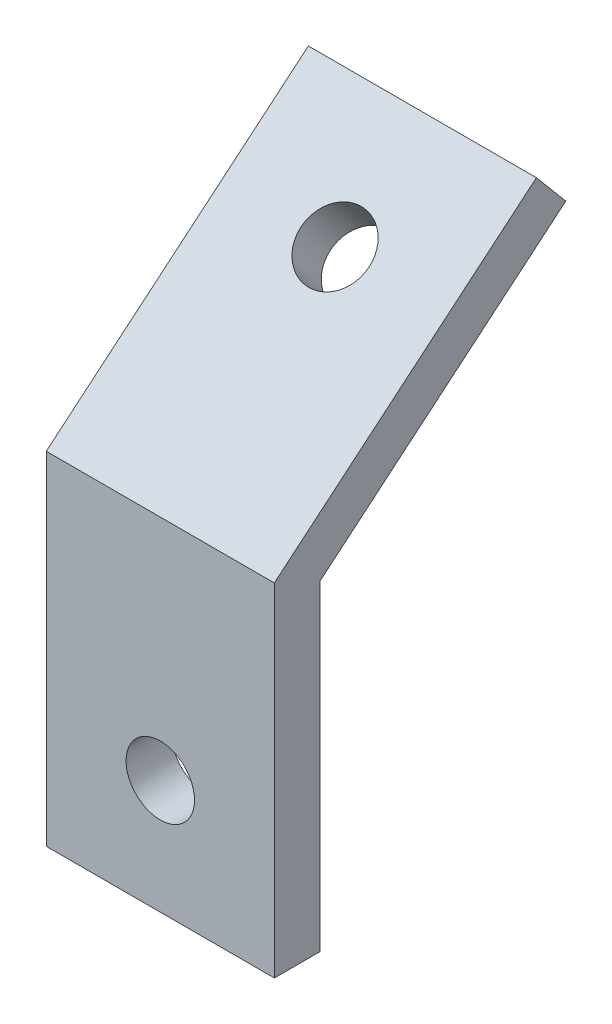
ISO-10303-21;
HEADER;
FILE_DESCRIPTION(('STEP AP214'),'2;1');
FILE_NAME('part.step','',(''),(''),'','','');
FILE_SCHEMA(('AUTOMOTIVE_DESIGN { 1 0 10303 214 1 1 1 1 }'));
ENDSEC;
DATA;
#1=APPLICATION_CONTEXT('core data for automotive mechanical design processes');
#2=APPLICATION_PROTOCOL_DEFINITION('international standard','automotive_design',2000,#1);
#3=PRODUCT_CONTEXT('',#1,'mechanical');
#4=PRODUCT('Part','Part','',(#3));
#5=PRODUCT_RELATED_PRODUCT_CATEGORY('part','',(#4));
#6=PRODUCT_DEFINITION_FORMATION('','',#4);
#7=PRODUCT_DEFINITION_CONTEXT('part definition',#1,'design');
#8=PRODUCT_DEFINITION('design','',#6,#7);
#9=PRODUCT_DEFINITION_SHAPE('','',#8);
#10=(LENGTH_UNIT() NAMED_UNIT(*) SI_UNIT(.MILLI.,.METRE.));
#11=(NAMED_UNIT(*) PLANE_ANGLE_UNIT() SI_UNIT($,.RADIAN.));
#12=(NAMED_UNIT(*) SI_UNIT($,.STERADIAN.) SOLID_ANGLE_UNIT());
#13=UNCERTAINTY_MEASURE_WITH_UNIT(LENGTH_MEASURE(1.E-05),#10,'distance_accuracy_value','');
#14=(GEOMETRIC_REPRESENTATION_CONTEXT(3) GLOBAL_UNCERTAINTY_ASSIGNED_CONTEXT((#13)) GLOBAL_UNIT_ASSIGNED_CONTEXT((#10,
#11,#12)) REPRESENTATION_CONTEXT('',''));
#15=CARTESIAN_POINT('',(0.,0.,0.));
#16=DIRECTION('',(0.,0.,1.));
#17=DIRECTION('',(1.,0.,0.));
#18=AXIS2_PLACEMENT_3D('',#15,#16,#17);
#19=CARTESIAN_POINT('',(10.,0.,-2.));
#20=DIRECTION('',(0.,1.,0.));
#21=DIRECTION('',(0.,0.,1.));
#22=AXIS2_PLACEMENT_3D('',#19,#20,#21);
#23=PLANE('',#22);
#24=DIRECTION('',(0.,0.,-1.));
#25=VECTOR('',#24,1.);
#26=CARTESIAN_POINT('',(0.,0.,-2.));
#27=LINE('',#26,#25);
#28=CARTESIAN_POINT('',(0.,0.,0.));
#29=VERTEX_POINT('',#28);
#30=CARTESIAN_POINT('',(0.,0.,-2.));
#31=VERTEX_POINT('',#30);
#32=EDGE_CURVE('E117',#29,#31,#27,.T.);
#33=ORIENTED_EDGE('',*,*,#32,.T.);
#34=DIRECTION('',(-1.,0.,0.));
#35=VECTOR('',#34,1.);
#36=CARTESIAN_POINT('',(10.,0.,-2.));
#37=LINE('',#36,#35);
#38=CARTESIAN_POINT('',(10.,0.,-2.));
#39=VERTEX_POINT('',#38);
#40=EDGE_CURVE('E11',#39,#31,#37,.T.);
#41=ORIENTED_EDGE('',*,*,#40,.F.);
#42=DIRECTION('',(0.,0.,-1.));
#43=VECTOR('',#42,1.);
#44=CARTESIAN_POINT('',(10.,0.,-2.));
#45=LINE('',#44,#43);
#46=CARTESIAN_POINT('',(10.,0.,0.));
#47=VERTEX_POINT('',#46);
#48=EDGE_CURVE('E128',#47,#39,#45,.T.);
#49=ORIENTED_EDGE('',*,*,#48,.F.);
#50=DIRECTION('',(-1.,0.,0.));
#51=VECTOR('',#50,1.);
#52=CARTESIAN_POINT('',(10.,0.,0.));
#53=LINE('',#52,#51);
#54=EDGE_CURVE('E113',#47,#29,#53,.T.);
#55=ORIENTED_EDGE('',*,*,#54,.T.);
#56=EDGE_LOOP('',(#33,#41,#49,#55));
#57=FACE_BOUND('',#56,.T.);
#58=ADVANCED_FACE('F33',(#57),#23,.F.);
#59=CARTESIAN_POINT('',(10.,14.06738468369,-2.));
#60=DIRECTION('',(0.,0.,1.));
#61=DIRECTION('',(0.,-1.,0.));
#62=AXIS2_PLACEMENT_3D('',#59,#60,#61);
#63=PLANE('',#62);
#64=CARTESIAN_POINT('',(5.,5.,-2.));
#65=DIRECTION('',(0.,0.,1.));
#66=DIRECTION('',(0.,-1.,0.));
#67=AXIS2_PLACEMENT_3D('',#64,#65,#66);
#68=CIRCLE('',#67,1.5);
#69=CARTESIAN_POINT('',(5.,3.5,-2.));
#70=VERTEX_POINT('',#69);
#71=EDGE_CURVE('E121',#70,#70,#68,.T.);
#72=ORIENTED_EDGE('',*,*,#71,.T.);
#73=EDGE_LOOP('',(#72));
#74=FACE_BOUND('',#73,.T.);
#75=DIRECTION('',(0.,1.,0.));
#76=VECTOR('',#75,1.);
#77=CARTESIAN_POINT('',(0.,14.06738468369,-2.));
#78=LINE('',#77,#76);
#79=CARTESIAN_POINT('',(0.,14.06738468369,-2.));
#80=VERTEX_POINT('',#79);
#81=EDGE_CURVE('E120',#31,#80,#78,.T.);
#82=ORIENTED_EDGE('',*,*,#81,.T.);
#83=DIRECTION('',(-1.,0.,0.));
#84=VECTOR('',#83,1.);
#85=CARTESIAN_POINT('',(10.,14.06738468369,-2.));
#86=LINE('',#85,#84);
#87=CARTESIAN_POINT('',(10.,14.06738468369,-2.));
#88=VERTEX_POINT('',#87);
#89=EDGE_CURVE('E41',#88,#80,#86,.T.);
#90=ORIENTED_EDGE('',*,*,#89,.F.);
#91=DIRECTION('',(0.,1.,0.));
#92=VECTOR('',#91,1.);
#93=CARTESIAN_POINT('',(10.,14.06738468369,-2.));
#94=LINE('',#93,#92);
#95=EDGE_CURVE('E86',#39,#88,#94,.T.);
#96=ORIENTED_EDGE('',*,*,#95,.F.);
#97=ORIENTED_EDGE('',*,*,#40,.T.);
#98=EDGE_LOOP('',(#82,#90,#96,#97));
#99=FACE_BOUND('',#98,.T.);
#100=ADVANCED_FACE('F155',(#74,#99),#63,.F.);
#101=CARTESIAN_POINT('',(10.,23.1097252590601,-12.7762418661578));
#102=DIRECTION('',(0.,0.766044443118979,0.642787609686539));
#103=DIRECTION('',(0.,-0.642787609686539,0.766044443118979));
#104=AXIS2_PLACEMENT_3D('',#101,#102,#103);
#105=PLANE('',#104);
#106=CARTESIAN_POINT('',(5.,19.8957872106274,-8.94601965056286));
#107=DIRECTION('',(0.,0.766044443118979,0.642787609686539));
#108=DIRECTION('',(0.,-0.642787609686539,0.766044443118979));
#109=AXIS2_PLACEMENT_3D('',#106,#107,#108);
#110=CIRCLE('',#109,1.5);
#111=CARTESIAN_POINT('',(5.,18.9316057960976,-7.79695298588439));
#112=VERTEX_POINT('',#111);
#113=EDGE_CURVE('E236',#112,#112,#110,.T.);
#114=ORIENTED_EDGE('',*,*,#113,.T.);
#115=EDGE_LOOP('',(#114));
#116=FACE_BOUND('',#115,.T.);
#117=DIRECTION('',(0.,0.642787609686539,-0.766044443118979));
#118=VECTOR('',#117,1.);
#119=CARTESIAN_POINT('',(0.,23.1097252590601,-12.7762418661578));
#120=LINE('',#119,#118);
#121=CARTESIAN_POINT('',(0.,23.1097252590601,-12.7762418661578));
#122=VERTEX_POINT('',#121);
#123=EDGE_CURVE('E123',#80,#122,#120,.T.);
#124=ORIENTED_EDGE('',*,*,#123,.T.);
#125=DIRECTION('',(-1.,0.,0.));
#126=VECTOR('',#125,1.);
#127=CARTESIAN_POINT('',(10.,23.1097252590601,-12.7762418661578));
#128=LINE('',#127,#126);
#129=CARTESIAN_POINT('',(10.,23.1097252590601,-12.7762418661578));
#130=VERTEX_POINT('',#129);
#131=EDGE_CURVE('E108',#130,#122,#128,.T.);
#132=ORIENTED_EDGE('',*,*,#131,.F.);
#133=DIRECTION('',(0.,0.642787609686539,-0.766044443118979));
#134=VECTOR('',#133,1.);
#135=CARTESIAN_POINT('',(10.,23.1097252590601,-12.7762418661578));
#136=LINE('',#135,#134);
#137=EDGE_CURVE('E99',#88,#130,#136,.T.);
#138=ORIENTED_EDGE('',*,*,#137,.F.);
#139=ORIENTED_EDGE('',*,*,#89,.T.);
#140=EDGE_LOOP('',(#124,#132,#138,#139));
#141=FACE_BOUND('',#140,.T.);
#142=ADVANCED_FACE('F134',(#116,#141),#105,.F.);
#143=CARTESIAN_POINT('',(10.,24.6418141452981,-11.4906666467847));
#144=DIRECTION('',(0.,-0.642787609686538,0.766044443118979));
#145=DIRECTION('',(0.,-0.766044443118979,-0.642787609686538));
#146=AXIS2_PLACEMENT_3D('',#143,#144,#145);
#147=PLANE('',#146);
#148=DIRECTION('',(0.,0.766044443118979,0.642787609686538));
#149=VECTOR('',#148,1.);
#150=CARTESIAN_POINT('',(0.,24.6418141452981,-11.4906666467847));
#151=LINE('',#150,#149);
#152=CARTESIAN_POINT('',(0.,24.6418141452981,-11.4906666467847));
#153=VERTEX_POINT('',#152);
#154=EDGE_CURVE('E107',#122,#153,#151,.T.);
#155=ORIENTED_EDGE('',*,*,#154,.T.);
#156=DIRECTION('',(-1.,0.,0.));
#157=VECTOR('',#156,1.);
#158=CARTESIAN_POINT('',(10.,24.6418141452981,-11.4906666467847));
#159=LINE('',#158,#157);
#160=CARTESIAN_POINT('',(10.,24.6418141452981,-11.4906666467847));
#161=VERTEX_POINT('',#160);
#162=EDGE_CURVE('E104',#161,#153,#159,.T.);
#163=ORIENTED_EDGE('',*,*,#162,.F.);
#164=DIRECTION('',(0.,0.766044443118979,0.642787609686538));
#165=VECTOR('',#164,1.);
#166=CARTESIAN_POINT('',(10.,24.6418141452981,-11.4906666467847));
#167=LINE('',#166,#165);
#168=EDGE_CURVE('E93',#130,#161,#167,.T.);
#169=ORIENTED_EDGE('',*,*,#168,.F.);
#170=ORIENTED_EDGE('',*,*,#131,.T.);
#171=EDGE_LOOP('',(#155,#163,#169,#170));
#172=FACE_BOUND('',#171,.T.);
#173=ADVANCED_FACE('F105',(#172),#147,.F.);
#174=CARTESIAN_POINT('',(10.,15.,0.));
#175=DIRECTION('',(0.,-0.766044443118979,-0.642787609686538));
#176=DIRECTION('',(0.,0.642787609686538,-0.766044443118979));
#177=AXIS2_PLACEMENT_3D('',#174,#175,#176);
#178=PLANE('',#177);
#179=CARTESIAN_POINT('',(5.,21.4278760968654,-7.66044443118978));
#180=DIRECTION('',(0.,0.766044443118979,0.642787609686538));
#181=DIRECTION('',(0.,-0.642787609686538,0.766044443118979));
#182=AXIS2_PLACEMENT_3D('',#179,#180,#181);
#183=CIRCLE('',#182,1.5);
#184=CARTESIAN_POINT('',(5.,20.4636946823356,-6.51137776651132));
#185=VERTEX_POINT('',#184);
#186=EDGE_CURVE('E243',#185,#185,#183,.T.);
#187=ORIENTED_EDGE('',*,*,#186,.F.);
#188=EDGE_LOOP('',(#187));
#189=FACE_BOUND('',#188,.T.);
#190=DIRECTION('',(0.,-0.642787609686538,0.766044443118979));
#191=VECTOR('',#190,1.);
#192=CARTESIAN_POINT('',(0.,15.,0.));
#193=LINE('',#192,#191);
#194=CARTESIAN_POINT('',(0.,15.,0.));
#195=VERTEX_POINT('',#194);
#196=EDGE_CURVE('E72',#153,#195,#193,.T.);
#197=ORIENTED_EDGE('',*,*,#196,.T.);
#198=DIRECTION('',(-1.,0.,0.));
#199=VECTOR('',#198,1.);
#200=CARTESIAN_POINT('',(10.,15.,0.));
#201=LINE('',#200,#199);
#202=CARTESIAN_POINT('',(10.,15.,0.));
#203=VERTEX_POINT('',#202);
#204=EDGE_CURVE('E109',#203,#195,#201,.T.);
#205=ORIENTED_EDGE('',*,*,#204,.F.);
#206=DIRECTION('',(0.,-0.642787609686538,0.766044443118979));
#207=VECTOR('',#206,1.);
#208=CARTESIAN_POINT('',(10.,15.,0.));
#209=LINE('',#208,#207);
#210=EDGE_CURVE('E97',#161,#203,#209,.T.);
#211=ORIENTED_EDGE('',*,*,#210,.F.);
#212=ORIENTED_EDGE('',*,*,#162,.T.);
#213=EDGE_LOOP('',(#197,#205,#211,#212));
#214=FACE_BOUND('',#213,.T.);
#215=ADVANCED_FACE('F111',(#189,#214),#178,.F.);
#216=CARTESIAN_POINT('',(10.,0.,0.));
#217=DIRECTION('',(0.,0.,-1.));
#218=DIRECTION('',(-1.,0.,0.));
#219=AXIS2_PLACEMENT_3D('',#216,#217,#218);
#220=PLANE('',#219);
#221=CARTESIAN_POINT('',(5.,5.,0.));
#222=DIRECTION('',(0.,0.,1.));
#223=DIRECTION('',(1.,0.,0.));
#224=AXIS2_PLACEMENT_3D('',#221,#222,#223);
#225=CIRCLE('',#224,1.5);
#226=CARTESIAN_POINT('',(6.5,5.,0.));
#227=VERTEX_POINT('',#226);
#228=EDGE_CURVE('E233',#227,#227,#225,.T.);
#229=ORIENTED_EDGE('',*,*,#228,.F.);
#230=EDGE_LOOP('',(#229));
#231=FACE_BOUND('',#230,.T.);
#232=DIRECTION('',(0.,-1.,0.));
#233=VECTOR('',#232,1.);
#234=CARTESIAN_POINT('',(0.,0.,0.));
#235=LINE('',#234,#233);
#236=EDGE_CURVE('E78',#195,#29,#235,.T.);
#237=ORIENTED_EDGE('',*,*,#236,.T.);
#238=ORIENTED_EDGE('',*,*,#54,.F.);
#239=DIRECTION('',(0.,-1.,0.));
#240=VECTOR('',#239,1.);
#241=CARTESIAN_POINT('',(10.,0.,0.));
#242=LINE('',#241,#240);
#243=EDGE_CURVE('E49',#203,#47,#242,.T.);
#244=ORIENTED_EDGE('',*,*,#243,.F.);
#245=ORIENTED_EDGE('',*,*,#204,.T.);
#246=EDGE_LOOP('',(#237,#238,#244,#245));
#247=FACE_BOUND('',#246,.T.);
#248=ADVANCED_FACE('F141',(#231,#247),#220,.F.);
#249=CARTESIAN_POINT('',(10.,0.,0.));
#250=DIRECTION('',(-1.,0.,0.));
#251=DIRECTION('',(0.,0.,1.));
#252=AXIS2_PLACEMENT_3D('',#249,#250,#251);
#253=PLANE('',#252);
#254=ORIENTED_EDGE('',*,*,#48,.T.);
#255=ORIENTED_EDGE('',*,*,#95,.T.);
#256=ORIENTED_EDGE('',*,*,#137,.T.);
#257=ORIENTED_EDGE('',*,*,#168,.T.);
#258=ORIENTED_EDGE('',*,*,#210,.T.);
#259=ORIENTED_EDGE('',*,*,#243,.T.);
#260=EDGE_LOOP('',(#254,#255,#256,#257,#258,#259));
#261=FACE_BOUND('',#260,.T.);
#262=ADVANCED_FACE('F95',(#261),#253,.F.);
#263=CARTESIAN_POINT('',(0.,0.,0.));
#264=DIRECTION('',(-1.,0.,0.));
#265=DIRECTION('',(0.,0.,1.));
#266=AXIS2_PLACEMENT_3D('',#263,#264,#265);
#267=PLANE('',#266);
#268=ORIENTED_EDGE('',*,*,#32,.F.);
#269=ORIENTED_EDGE('',*,*,#236,.F.);
#270=ORIENTED_EDGE('',*,*,#196,.F.);
#271=ORIENTED_EDGE('',*,*,#154,.F.);
#272=ORIENTED_EDGE('',*,*,#123,.F.);
#273=ORIENTED_EDGE('',*,*,#81,.F.);
#274=EDGE_LOOP('',(#268,#269,#270,#271,#272,#273));
#275=FACE_BOUND('',#274,.T.);
#276=ADVANCED_FACE('F137',(#275),#267,.T.);
#277=CARTESIAN_POINT('',(5.,5.,-10.));
#278=DIRECTION('',(0.,0.,1.));
#279=DIRECTION('',(1.,0.,0.));
#280=AXIS2_PLACEMENT_3D('',#277,#278,#279);
#281=CYLINDRICAL_SURFACE('',#280,1.5);
#282=ORIENTED_EDGE('',*,*,#228,.T.);
#283=EDGE_LOOP('',(#282));
#284=FACE_BOUND('',#283,.T.);
#285=ORIENTED_EDGE('',*,*,#71,.F.);
#286=EDGE_LOOP('',(#285));
#287=FACE_BOUND('',#286,.T.);
#288=ADVANCED_FACE('F190',(#284,#287),#281,.F.);
#289=CARTESIAN_POINT('',(5.,13.7674316656756,-14.0883205280552));
#290=DIRECTION('',(0.,0.766044443118979,0.642787609686538));
#291=DIRECTION('',(0.,-0.642787609686538,0.766044443118979));
#292=AXIS2_PLACEMENT_3D('',#289,#290,#291);
#293=CYLINDRICAL_SURFACE('',#292,1.5);
#294=ORIENTED_EDGE('',*,*,#186,.T.);
#295=EDGE_LOOP('',(#294));
#296=FACE_BOUND('',#295,.T.);
#297=ORIENTED_EDGE('',*,*,#113,.F.);
#298=EDGE_LOOP('',(#297));
#299=FACE_BOUND('',#298,.T.);
#300=ADVANCED_FACE('F186',(#296,#299),#293,.F.);
#301=CLOSED_SHELL('',(#58,#100,#142,#173,#215,#248,#262,#276,#288,#300));
#302=MANIFOLD_SOLID_BREP('B2',#301);
#303=ADVANCED_BREP_SHAPE_REPRESENTATION('',(#18,#302),#14);
#304=SHAPE_DEFINITION_REPRESENTATION(#9,#303);
ENDSEC;
END-ISO-10303-21;
